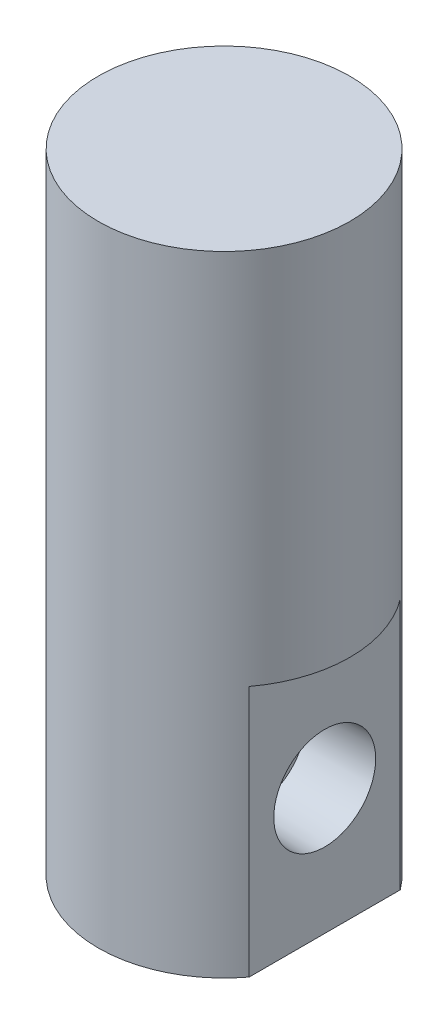
ISO-10303-21;
HEADER;
FILE_DESCRIPTION(('STEP AP214'),'2;1');
FILE_NAME('part.step','',(''),(''),'','','');
FILE_SCHEMA(('AUTOMOTIVE_DESIGN { 1 0 10303 214 1 1 1 1 }'));
ENDSEC;
DATA;
#1=APPLICATION_CONTEXT('core data for automotive mechanical design processes');
#2=APPLICATION_PROTOCOL_DEFINITION('international standard','automotive_design',2000,#1);
#3=PRODUCT_CONTEXT('',#1,'mechanical');
#4=PRODUCT('Part','Part','',(#3));
#5=PRODUCT_RELATED_PRODUCT_CATEGORY('part','',(#4));
#6=PRODUCT_DEFINITION_FORMATION('','',#4);
#7=PRODUCT_DEFINITION_CONTEXT('part definition',#1,'design');
#8=PRODUCT_DEFINITION('design','',#6,#7);
#9=PRODUCT_DEFINITION_SHAPE('','',#8);
#10=(LENGTH_UNIT() NAMED_UNIT(*) SI_UNIT(.MILLI.,.METRE.));
#11=(NAMED_UNIT(*) PLANE_ANGLE_UNIT() SI_UNIT($,.RADIAN.));
#12=(NAMED_UNIT(*) SI_UNIT($,.STERADIAN.) SOLID_ANGLE_UNIT());
#13=UNCERTAINTY_MEASURE_WITH_UNIT(LENGTH_MEASURE(1.E-05),#10,'distance_accuracy_value','');
#14=(GEOMETRIC_REPRESENTATION_CONTEXT(3) GLOBAL_UNCERTAINTY_ASSIGNED_CONTEXT((#13)) GLOBAL_UNIT_ASSIGNED_CONTEXT((#10,
#11,#12)) REPRESENTATION_CONTEXT('',''));
#15=CARTESIAN_POINT('',(0.,0.,0.));
#16=DIRECTION('',(0.,0.,1.));
#17=DIRECTION('',(1.,0.,0.));
#18=AXIS2_PLACEMENT_3D('',#15,#16,#17);
#19=CARTESIAN_POINT('',(0.,63.5,0.));
#20=DIRECTION('',(0.,-1.,0.));
#21=DIRECTION('',(0.,0.,-1.));
#22=AXIS2_PLACEMENT_3D('',#19,#20,#21);
#23=CYLINDRICAL_SURFACE('',#22,12.7);
#24=CARTESIAN_POINT('',(0.,63.5,0.));
#25=DIRECTION('',(0.,1.,0.));
#26=DIRECTION('',(0.,0.,1.));
#27=AXIS2_PLACEMENT_3D('',#24,#25,#26);
#28=CIRCLE('',#27,12.7);
#29=CARTESIAN_POINT('',(0.,63.5,12.7));
#30=VERTEX_POINT('',#29);
#31=EDGE_CURVE('E11',#30,#30,#28,.T.);
#32=ORIENTED_EDGE('',*,*,#31,.F.);
#33=EDGE_LOOP('',(#32));
#34=FACE_BOUND('',#33,.T.);
#35=CARTESIAN_POINT('',(0.,25.4,0.));
#36=DIRECTION('',(0.,-1.,0.));
#37=DIRECTION('',(0.,0.,-1.));
#38=AXIS2_PLACEMENT_3D('',#35,#36,#37);
#39=CIRCLE('',#38,12.7);
#40=CARTESIAN_POINT('',(10.16,25.4,-7.62));
#41=VERTEX_POINT('',#40);
#42=CARTESIAN_POINT('',(10.16,25.4,7.62));
#43=VERTEX_POINT('',#42);
#44=EDGE_CURVE('E78',#41,#43,#39,.T.);
#45=ORIENTED_EDGE('',*,*,#44,.F.);
#46=DIRECTION('',(0.,-1.,0.));
#47=VECTOR('',#46,1.);
#48=CARTESIAN_POINT('',(10.16,25.4,-7.62));
#49=LINE('',#48,#47);
#50=CARTESIAN_POINT('',(10.16,0.,-7.62));
#51=VERTEX_POINT('',#50);
#52=EDGE_CURVE('E84',#41,#51,#49,.T.);
#53=ORIENTED_EDGE('',*,*,#52,.T.);
#54=CARTESIAN_POINT('',(0.,0.,0.));
#55=DIRECTION('',(0.,1.,0.));
#56=DIRECTION('',(0.,0.,1.));
#57=AXIS2_PLACEMENT_3D('',#54,#55,#56);
#58=CIRCLE('',#57,12.7);
#59=CARTESIAN_POINT('',(-10.16,0.,-7.62));
#60=VERTEX_POINT('',#59);
#61=EDGE_CURVE('E57',#51,#60,#58,.T.);
#62=ORIENTED_EDGE('',*,*,#61,.T.);
#63=DIRECTION('',(0.,-1.,0.));
#64=VECTOR('',#63,1.);
#65=CARTESIAN_POINT('',(-10.16,25.4,-7.62));
#66=LINE('',#65,#64);
#67=CARTESIAN_POINT('',(-10.16,25.4,-7.62));
#68=VERTEX_POINT('',#67);
#69=EDGE_CURVE('E99',#68,#60,#66,.T.);
#70=ORIENTED_EDGE('',*,*,#69,.F.);
#71=CARTESIAN_POINT('',(0.,25.4,0.));
#72=DIRECTION('',(0.,-1.,0.));
#73=DIRECTION('',(0.,0.,-1.));
#74=AXIS2_PLACEMENT_3D('',#71,#72,#73);
#75=CIRCLE('',#74,12.7);
#76=CARTESIAN_POINT('',(-10.16,25.4,7.62));
#77=VERTEX_POINT('',#76);
#78=EDGE_CURVE('E94',#77,#68,#75,.T.);
#79=ORIENTED_EDGE('',*,*,#78,.F.);
#80=DIRECTION('',(0.,-1.,0.));
#81=VECTOR('',#80,1.);
#82=CARTESIAN_POINT('',(-10.16,25.4,7.62));
#83=LINE('',#82,#81);
#84=CARTESIAN_POINT('',(-10.16,0.,7.62));
#85=VERTEX_POINT('',#84);
#86=EDGE_CURVE('E101',#77,#85,#83,.T.);
#87=ORIENTED_EDGE('',*,*,#86,.T.);
#88=CARTESIAN_POINT('',(10.16,0.,7.62));
#89=VERTEX_POINT('',#88);
#90=EDGE_CURVE('E38',#85,#89,#58,.T.);
#91=ORIENTED_EDGE('',*,*,#90,.T.);
#92=DIRECTION('',(0.,-1.,0.));
#93=VECTOR('',#92,1.);
#94=CARTESIAN_POINT('',(10.16,25.4,7.62));
#95=LINE('',#94,#93);
#96=EDGE_CURVE('E49',#43,#89,#95,.T.);
#97=ORIENTED_EDGE('',*,*,#96,.F.);
#98=EDGE_LOOP('',(#45,#53,#62,#70,#79,#87,#91,#97));
#99=FACE_BOUND('',#98,.T.);
#100=ADVANCED_FACE('F35',(#34,#99),#23,.T.);
#101=CARTESIAN_POINT('',(0.,63.5,0.));
#102=DIRECTION('',(0.,1.,0.));
#103=DIRECTION('',(0.,0.,1.));
#104=AXIS2_PLACEMENT_3D('',#101,#102,#103);
#105=PLANE('',#104);
#106=ORIENTED_EDGE('',*,*,#31,.T.);
#107=EDGE_LOOP('',(#106));
#108=FACE_BOUND('',#107,.T.);
#109=ADVANCED_FACE('F144',(#108),#105,.T.);
#110=CARTESIAN_POINT('',(0.,0.,0.));
#111=DIRECTION('',(0.,1.,0.));
#112=DIRECTION('',(0.,0.,1.));
#113=AXIS2_PLACEMENT_3D('',#110,#111,#112);
#114=PLANE('',#113);
#115=ORIENTED_EDGE('',*,*,#61,.F.);
#116=DIRECTION('',(0.,0.,-1.));
#117=VECTOR('',#116,1.);
#118=CARTESIAN_POINT('',(10.16,0.,7.62));
#119=LINE('',#118,#117);
#120=EDGE_CURVE('E81',#89,#51,#119,.T.);
#121=ORIENTED_EDGE('',*,*,#120,.F.);
#122=ORIENTED_EDGE('',*,*,#90,.F.);
#123=DIRECTION('',(0.,0.,1.));
#124=VECTOR('',#123,1.);
#125=CARTESIAN_POINT('',(-10.16,0.,7.62));
#126=LINE('',#125,#124);
#127=EDGE_CURVE('E90',#60,#85,#126,.T.);
#128=ORIENTED_EDGE('',*,*,#127,.F.);
#129=EDGE_LOOP('',(#115,#121,#122,#128));
#130=FACE_BOUND('',#129,.T.);
#131=ADVANCED_FACE('F109',(#130),#114,.F.);
#132=CARTESIAN_POINT('',(-10.16,25.4,7.62));
#133=DIRECTION('',(1.,0.,0.));
#134=DIRECTION('',(0.,0.,-1.));
#135=AXIS2_PLACEMENT_3D('',#132,#133,#134);
#136=PLANE('',#135);
#137=CARTESIAN_POINT('',(-10.16,12.7,0.));
#138=DIRECTION('',(-1.,0.,0.));
#139=DIRECTION('',(0.,0.,1.));
#140=AXIS2_PLACEMENT_3D('',#137,#138,#139);
#141=CIRCLE('',#140,5.1415188);
#142=CARTESIAN_POINT('',(-10.16,12.7,5.1415188));
#143=VERTEX_POINT('',#142);
#144=EDGE_CURVE('E117',#143,#143,#141,.T.);
#145=ORIENTED_EDGE('',*,*,#144,.F.);
#146=EDGE_LOOP('',(#145));
#147=FACE_BOUND('',#146,.T.);
#148=ORIENTED_EDGE('',*,*,#127,.T.);
#149=ORIENTED_EDGE('',*,*,#86,.F.);
#150=DIRECTION('',(0.,0.,1.));
#151=VECTOR('',#150,1.);
#152=CARTESIAN_POINT('',(-10.16,25.4,7.62));
#153=LINE('',#152,#151);
#154=EDGE_CURVE('E96',#68,#77,#153,.T.);
#155=ORIENTED_EDGE('',*,*,#154,.F.);
#156=ORIENTED_EDGE('',*,*,#69,.T.);
#157=EDGE_LOOP('',(#148,#149,#155,#156));
#158=FACE_BOUND('',#157,.T.);
#159=ADVANCED_FACE('F106',(#147,#158),#136,.F.);
#160=CARTESIAN_POINT('',(0.,25.4,0.));
#161=DIRECTION('',(0.,-1.,0.));
#162=DIRECTION('',(0.,0.,-1.));
#163=AXIS2_PLACEMENT_3D('',#160,#161,#162);
#164=PLANE('',#163);
#165=ORIENTED_EDGE('',*,*,#78,.T.);
#166=ORIENTED_EDGE('',*,*,#154,.T.);
#167=EDGE_LOOP('',(#165,#166));
#168=FACE_BOUND('',#167,.T.);
#169=ADVANCED_FACE('F133',(#168),#164,.T.);
#170=CARTESIAN_POINT('',(10.16,25.4,7.62));
#171=DIRECTION('',(-1.,0.,0.));
#172=DIRECTION('',(0.,0.,1.));
#173=AXIS2_PLACEMENT_3D('',#170,#171,#172);
#174=PLANE('',#173);
#175=CARTESIAN_POINT('',(10.16,12.7,0.));
#176=DIRECTION('',(1.,0.,0.));
#177=DIRECTION('',(0.,0.,-1.));
#178=AXIS2_PLACEMENT_3D('',#175,#176,#177);
#179=CIRCLE('',#178,5.1415188);
#180=CARTESIAN_POINT('',(10.16,12.7,-5.1415188));
#181=VERTEX_POINT('',#180);
#182=EDGE_CURVE('E126',#181,#181,#179,.T.);
#183=ORIENTED_EDGE('',*,*,#182,.F.);
#184=EDGE_LOOP('',(#183));
#185=FACE_BOUND('',#184,.T.);
#186=ORIENTED_EDGE('',*,*,#120,.T.);
#187=ORIENTED_EDGE('',*,*,#52,.F.);
#188=DIRECTION('',(0.,0.,-1.));
#189=VECTOR('',#188,1.);
#190=CARTESIAN_POINT('',(10.16,25.4,7.62));
#191=LINE('',#190,#189);
#192=EDGE_CURVE('E80',#43,#41,#191,.T.);
#193=ORIENTED_EDGE('',*,*,#192,.F.);
#194=ORIENTED_EDGE('',*,*,#96,.T.);
#195=EDGE_LOOP('',(#186,#187,#193,#194));
#196=FACE_BOUND('',#195,.T.);
#197=ADVANCED_FACE('F83',(#185,#196),#174,.F.);
#198=CARTESIAN_POINT('',(0.,25.4,0.));
#199=DIRECTION('',(0.,-1.,0.));
#200=DIRECTION('',(0.,0.,-1.));
#201=AXIS2_PLACEMENT_3D('',#198,#199,#200);
#202=PLANE('',#201);
#203=ORIENTED_EDGE('',*,*,#44,.T.);
#204=ORIENTED_EDGE('',*,*,#192,.T.);
#205=EDGE_LOOP('',(#203,#204));
#206=FACE_BOUND('',#205,.T.);
#207=ADVANCED_FACE('F79',(#206),#202,.T.);
#208=CARTESIAN_POINT('',(-10.16,12.7,0.));
#209=DIRECTION('',(-1.,0.,0.));
#210=DIRECTION('',(0.,0.,1.));
#211=AXIS2_PLACEMENT_3D('',#208,#209,#210);
#212=CYLINDRICAL_SURFACE('',#211,4.2164);
#213=CARTESIAN_POINT('',(-3.302,12.7,0.));
#214=DIRECTION('',(-1.,0.,0.));
#215=DIRECTION('',(0.,0.,1.));
#216=AXIS2_PLACEMENT_3D('',#213,#214,#215);
#217=CIRCLE('',#216,4.2164);
#218=CARTESIAN_POINT('',(-3.302,12.7,4.2164));
#219=VERTEX_POINT('',#218);
#220=EDGE_CURVE('E110',#219,#219,#217,.T.);
#221=ORIENTED_EDGE('',*,*,#220,.T.);
#222=EDGE_LOOP('',(#221));
#223=FACE_BOUND('',#222,.T.);
#224=CARTESIAN_POINT('',(3.302,12.7,0.));
#225=DIRECTION('',(1.,0.,0.));
#226=DIRECTION('',(0.,0.,-1.));
#227=AXIS2_PLACEMENT_3D('',#224,#225,#226);
#228=CIRCLE('',#227,4.2164);
#229=CARTESIAN_POINT('',(3.302,12.7,-4.2164));
#230=VERTEX_POINT('',#229);
#231=EDGE_CURVE('E120',#230,#230,#228,.T.);
#232=ORIENTED_EDGE('',*,*,#231,.T.);
#233=EDGE_LOOP('',(#232));
#234=FACE_BOUND('',#233,.T.);
#235=ADVANCED_FACE('F139',(#223,#234),#212,.F.);
#236=CARTESIAN_POINT('',(-3.302,16.9164,0.));
#237=DIRECTION('',(1.,0.,0.));
#238=DIRECTION('',(0.,0.,-1.));
#239=AXIS2_PLACEMENT_3D('',#236,#237,#238);
#240=PLANE('',#239);
#241=ORIENTED_EDGE('',*,*,#220,.F.);
#242=EDGE_LOOP('',(#241));
#243=FACE_BOUND('',#242,.T.);
#244=CARTESIAN_POINT('',(-3.302,12.7,0.));
#245=DIRECTION('',(-1.,0.,0.));
#246=DIRECTION('',(0.,0.,1.));
#247=AXIS2_PLACEMENT_3D('',#244,#245,#246);
#248=CIRCLE('',#247,4.9361810959685);
#249=CARTESIAN_POINT('',(-3.302,12.7,4.9361810959685));
#250=VERTEX_POINT('',#249);
#251=EDGE_CURVE('E112',#250,#250,#248,.T.);
#252=ORIENTED_EDGE('',*,*,#251,.T.);
#253=EDGE_LOOP('',(#252));
#254=FACE_BOUND('',#253,.T.);
#255=ADVANCED_FACE('F165',(#243,#254),#240,.F.);
#256=CARTESIAN_POINT('',(-10.16,12.7,0.));
#257=DIRECTION('',(-1.,0.,0.));
#258=DIRECTION('',(0.,0.,1.));
#259=AXIS2_PLACEMENT_3D('',#256,#257,#258);
#260=CONICAL_SURFACE('',#259,5.1415188,0.0299323966717028);
#261=ORIENTED_EDGE('',*,*,#251,.F.);
#262=EDGE_LOOP('',(#261));
#263=FACE_BOUND('',#262,.T.);
#264=ORIENTED_EDGE('',*,*,#144,.T.);
#265=EDGE_LOOP('',(#264));
#266=FACE_BOUND('',#265,.T.);
#267=ADVANCED_FACE('F162',(#263,#266),#260,.F.);
#268=CARTESIAN_POINT('',(3.302,16.9164,0.));
#269=DIRECTION('',(-1.,0.,0.));
#270=DIRECTION('',(0.,0.,1.));
#271=AXIS2_PLACEMENT_3D('',#268,#269,#270);
#272=PLANE('',#271);
#273=ORIENTED_EDGE('',*,*,#231,.F.);
#274=EDGE_LOOP('',(#273));
#275=FACE_BOUND('',#274,.T.);
#276=CARTESIAN_POINT('',(3.302,12.7,0.));
#277=DIRECTION('',(1.,0.,0.));
#278=DIRECTION('',(0.,0.,-1.));
#279=AXIS2_PLACEMENT_3D('',#276,#277,#278);
#280=CIRCLE('',#279,4.9361810959685);
#281=CARTESIAN_POINT('',(3.302,12.7,-4.9361810959685));
#282=VERTEX_POINT('',#281);
#283=EDGE_CURVE('E123',#282,#282,#280,.T.);
#284=ORIENTED_EDGE('',*,*,#283,.T.);
#285=EDGE_LOOP('',(#284));
#286=FACE_BOUND('',#285,.T.);
#287=ADVANCED_FACE('F164',(#275,#286),#272,.F.);
#288=CARTESIAN_POINT('',(10.16,12.7,0.));
#289=DIRECTION('',(1.,0.,0.));
#290=DIRECTION('',(0.,0.,-1.));
#291=AXIS2_PLACEMENT_3D('',#288,#289,#290);
#292=CONICAL_SURFACE('',#291,5.1415188,0.0299323966717028);
#293=ORIENTED_EDGE('',*,*,#283,.F.);
#294=EDGE_LOOP('',(#293));
#295=FACE_BOUND('',#294,.T.);
#296=ORIENTED_EDGE('',*,*,#182,.T.);
#297=EDGE_LOOP('',(#296));
#298=FACE_BOUND('',#297,.T.);
#299=ADVANCED_FACE('F130',(#295,#298),#292,.F.);
#300=CLOSED_SHELL('',(#100,#109,#131,#159,#169,#197,#207,#235,#255,#267,#287,#299));
#301=MANIFOLD_SOLID_BREP('B2',#300);
#302=ADVANCED_BREP_SHAPE_REPRESENTATION('',(#18,#301),#14);
#303=SHAPE_DEFINITION_REPRESENTATION(#9,#302);
ENDSEC;
END-ISO-10303-21;
